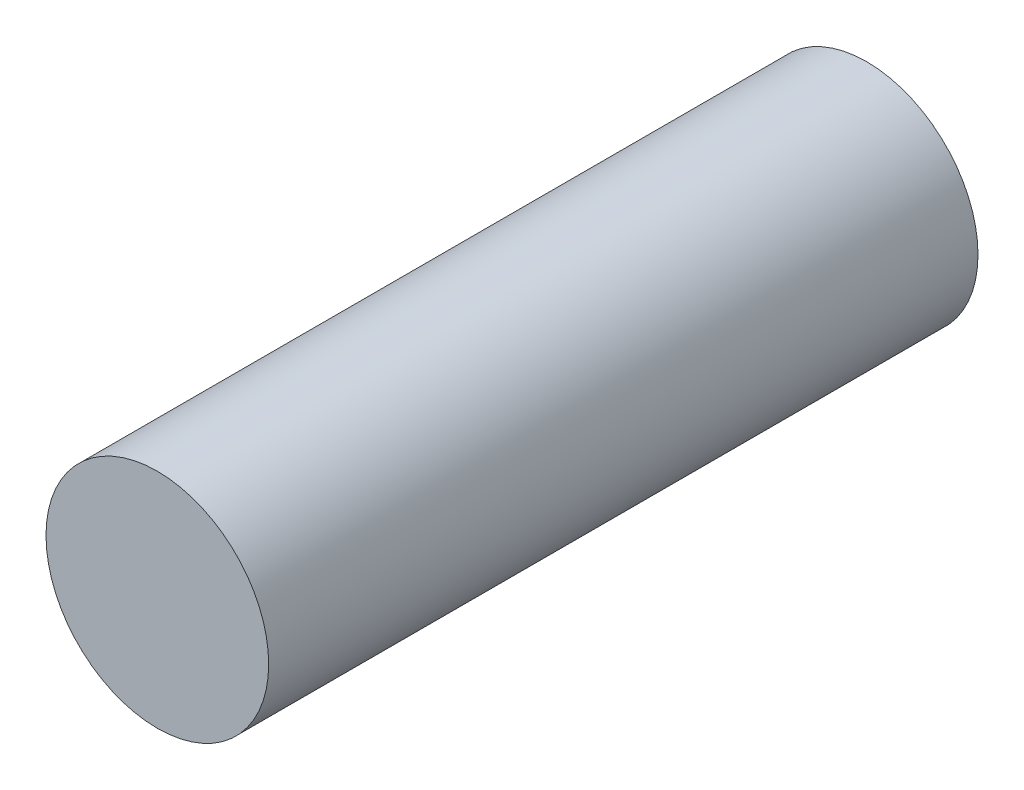
ISO-10303-21;
HEADER;
FILE_DESCRIPTION(('STEP AP214'),'2;1');
FILE_NAME('part.step','',(''),(''),'','','');
FILE_SCHEMA(('AUTOMOTIVE_DESIGN { 1 0 10303 214 1 1 1 1 }'));
ENDSEC;
DATA;
#1=APPLICATION_CONTEXT('core data for automotive mechanical design processes');
#2=APPLICATION_PROTOCOL_DEFINITION('international standard','automotive_design',2000,#1);
#3=PRODUCT_CONTEXT('',#1,'mechanical');
#4=PRODUCT('Part','Part','',(#3));
#5=PRODUCT_RELATED_PRODUCT_CATEGORY('part','',(#4));
#6=PRODUCT_DEFINITION_FORMATION('','',#4);
#7=PRODUCT_DEFINITION_CONTEXT('part definition',#1,'design');
#8=PRODUCT_DEFINITION('design','',#6,#7);
#9=PRODUCT_DEFINITION_SHAPE('','',#8);
#10=(LENGTH_UNIT() NAMED_UNIT(*) SI_UNIT(.MILLI.,.METRE.));
#11=(NAMED_UNIT(*) PLANE_ANGLE_UNIT() SI_UNIT($,.RADIAN.));
#12=(NAMED_UNIT(*) SI_UNIT($,.STERADIAN.) SOLID_ANGLE_UNIT());
#13=UNCERTAINTY_MEASURE_WITH_UNIT(LENGTH_MEASURE(1.E-05),#10,'distance_accuracy_value','');
#14=(GEOMETRIC_REPRESENTATION_CONTEXT(3) GLOBAL_UNCERTAINTY_ASSIGNED_CONTEXT((#13)) GLOBAL_UNIT_ASSIGNED_CONTEXT((#10,
#11,#12)) REPRESENTATION_CONTEXT('',''));
#15=CARTESIAN_POINT('',(0.,0.,0.));
#16=DIRECTION('',(0.,0.,1.));
#17=DIRECTION('',(1.,0.,0.));
#18=AXIS2_PLACEMENT_3D('',#15,#16,#17);
#19=CARTESIAN_POINT('',(12.0116774385576,-12.4903521436065,101.6));
#20=DIRECTION('',(0.,0.,-1.));
#21=DIRECTION('',(-1.,0.,0.));
#22=AXIS2_PLACEMENT_3D('',#19,#20,#21);
#23=CYLINDRICAL_SURFACE('',#22,15.9476563789101);
#24=CARTESIAN_POINT('',(12.0116774385576,-12.4903521436065,101.6));
#25=DIRECTION('',(0.,0.,1.));
#26=DIRECTION('',(1.,0.,0.));
#27=AXIS2_PLACEMENT_3D('',#24,#25,#26);
#28=CIRCLE('',#27,15.9476563789101);
#29=CARTESIAN_POINT('',(27.9593338174677,-12.4903521436065,101.6));
#30=VERTEX_POINT('',#29);
#31=EDGE_CURVE('E10',#30,#30,#28,.T.);
#32=ORIENTED_EDGE('',*,*,#31,.F.);
#33=EDGE_LOOP('',(#32));
#34=FACE_BOUND('',#33,.T.);
#35=CARTESIAN_POINT('',(12.0116774385576,-12.4903521436065,0.));
#36=DIRECTION('',(0.,0.,1.));
#37=DIRECTION('',(1.,0.,0.));
#38=AXIS2_PLACEMENT_3D('',#35,#36,#37);
#39=CIRCLE('',#38,15.9476563789101);
#40=CARTESIAN_POINT('',(27.9593338174677,-12.4903521436065,0.));
#41=VERTEX_POINT('',#40);
#42=EDGE_CURVE('E38',#41,#41,#39,.T.);
#43=ORIENTED_EDGE('',*,*,#42,.T.);
#44=EDGE_LOOP('',(#43));
#45=FACE_BOUND('',#44,.T.);
#46=ADVANCED_FACE('F35',(#34,#45),#23,.T.);
#47=CARTESIAN_POINT('',(12.0116774385576,-12.4903521436065,101.6));
#48=DIRECTION('',(0.,0.,1.));
#49=DIRECTION('',(1.,0.,0.));
#50=AXIS2_PLACEMENT_3D('',#47,#48,#49);
#51=PLANE('',#50);
#52=ORIENTED_EDGE('',*,*,#31,.T.);
#53=EDGE_LOOP('',(#52));
#54=FACE_BOUND('',#53,.T.);
#55=ADVANCED_FACE('F50',(#54),#51,.T.);
#56=CARTESIAN_POINT('',(12.0116774385576,-12.4903521436065,0.));
#57=DIRECTION('',(0.,0.,1.));
#58=DIRECTION('',(1.,0.,0.));
#59=AXIS2_PLACEMENT_3D('',#56,#57,#58);
#60=PLANE('',#59);
#61=ORIENTED_EDGE('',*,*,#42,.F.);
#62=EDGE_LOOP('',(#61));
#63=FACE_BOUND('',#62,.T.);
#64=ADVANCED_FACE('F48',(#63),#60,.F.);
#65=CLOSED_SHELL('',(#46,#55,#64));
#66=MANIFOLD_SOLID_BREP('B2',#65);
#67=ADVANCED_BREP_SHAPE_REPRESENTATION('',(#18,#66),#14);
#68=SHAPE_DEFINITION_REPRESENTATION(#9,#67);
ENDSEC;
END-ISO-10303-21;
